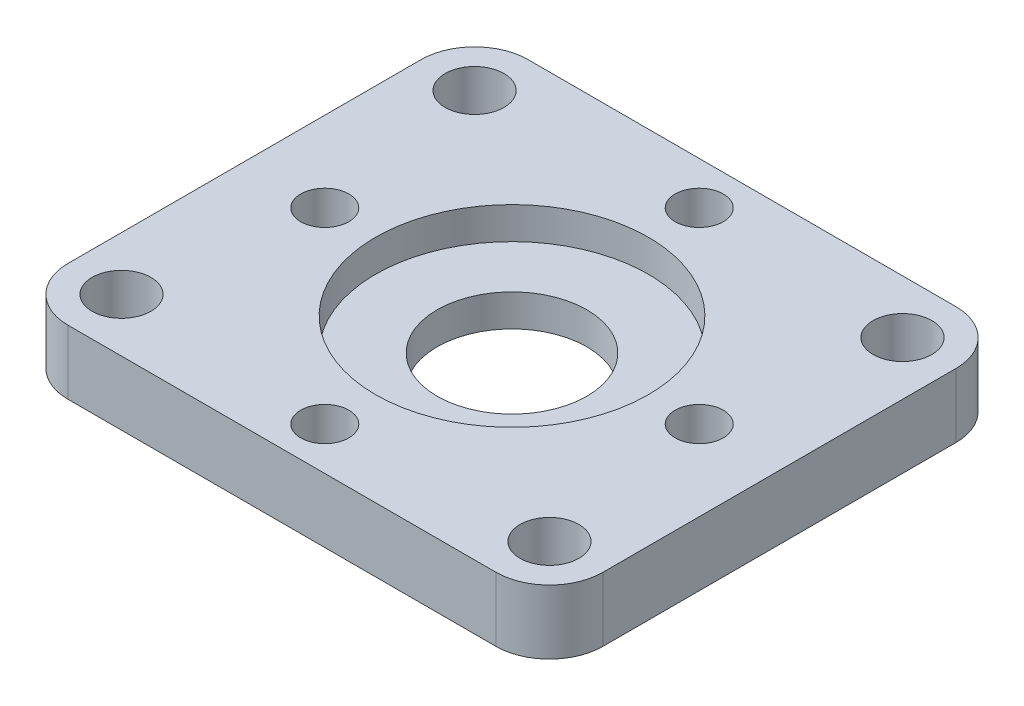
ISO-10303-21;
HEADER;
FILE_DESCRIPTION(('STEP AP214'),'2;1');
FILE_NAME('part.step','',(''),(''),'','','');
FILE_SCHEMA(('AUTOMOTIVE_DESIGN { 1 0 10303 214 1 1 1 1 }'));
ENDSEC;
DATA;
#1=APPLICATION_CONTEXT('core data for automotive mechanical design processes');
#2=APPLICATION_PROTOCOL_DEFINITION('international standard','automotive_design',2000,#1);
#3=PRODUCT_CONTEXT('',#1,'mechanical');
#4=PRODUCT('Part','Part','',(#3));
#5=PRODUCT_RELATED_PRODUCT_CATEGORY('part','',(#4));
#6=PRODUCT_DEFINITION_FORMATION('','',#4);
#7=PRODUCT_DEFINITION_CONTEXT('part definition',#1,'design');
#8=PRODUCT_DEFINITION('design','',#6,#7);
#9=PRODUCT_DEFINITION_SHAPE('','',#8);
#10=(LENGTH_UNIT() NAMED_UNIT(*) SI_UNIT(.MILLI.,.METRE.));
#11=(NAMED_UNIT(*) PLANE_ANGLE_UNIT() SI_UNIT($,.RADIAN.));
#12=(NAMED_UNIT(*) SI_UNIT($,.STERADIAN.) SOLID_ANGLE_UNIT());
#13=UNCERTAINTY_MEASURE_WITH_UNIT(LENGTH_MEASURE(1.E-05),#10,'distance_accuracy_value','');
#14=(GEOMETRIC_REPRESENTATION_CONTEXT(3) GLOBAL_UNCERTAINTY_ASSIGNED_CONTEXT((#13)) GLOBAL_UNIT_ASSIGNED_CONTEXT((#10,
#11,#12)) REPRESENTATION_CONTEXT('',''));
#15=CARTESIAN_POINT('',(0.,0.,0.));
#16=DIRECTION('',(0.,0.,1.));
#17=DIRECTION('',(1.,0.,0.));
#18=AXIS2_PLACEMENT_3D('',#15,#16,#17);
#19=CARTESIAN_POINT('',(0.,0.,0.));
#20=DIRECTION('',(0.,1.,0.));
#21=DIRECTION('',(0.,0.,1.));
#22=AXIS2_PLACEMENT_3D('',#19,#20,#21);
#23=CYLINDRICAL_SURFACE('',#22,7.);
#24=CARTESIAN_POINT('',(0.,0.,0.));
#25=DIRECTION('',(0.,1.,0.));
#26=DIRECTION('',(0.,0.,1.));
#27=AXIS2_PLACEMENT_3D('',#24,#25,#26);
#28=CIRCLE('',#27,7.);
#29=CARTESIAN_POINT('',(0.,0.,7.));
#30=VERTEX_POINT('',#29);
#31=EDGE_CURVE('E201',#30,#30,#28,.T.);
#32=ORIENTED_EDGE('',*,*,#31,.F.);
#33=EDGE_LOOP('',(#32));
#34=FACE_BOUND('',#33,.T.);
#35=CARTESIAN_POINT('',(0.,3.,0.));
#36=DIRECTION('',(0.,1.,0.));
#37=DIRECTION('',(0.,0.,1.));
#38=AXIS2_PLACEMENT_3D('',#35,#36,#37);
#39=CIRCLE('',#38,7.);
#40=CARTESIAN_POINT('',(0.,3.,7.));
#41=VERTEX_POINT('',#40);
#42=EDGE_CURVE('E152',#41,#41,#39,.F.);
#43=ORIENTED_EDGE('',*,*,#42,.F.);
#44=EDGE_LOOP('',(#43));
#45=FACE_BOUND('',#44,.T.);
#46=ADVANCED_FACE('F47',(#34,#45),#23,.F.);
#47=CARTESIAN_POINT('',(-25.,6.,0.));
#48=DIRECTION('',(-1.,0.,0.));
#49=DIRECTION('',(0.,0.,1.));
#50=AXIS2_PLACEMENT_3D('',#47,#48,#49);
#51=PLANE('',#50);
#52=DIRECTION('',(0.,0.,-1.));
#53=VECTOR('',#52,1.);
#54=CARTESIAN_POINT('',(-25.,0.,0.));
#55=LINE('',#54,#53);
#56=CARTESIAN_POINT('',(-25.,0.,16.5));
#57=VERTEX_POINT('',#56);
#58=CARTESIAN_POINT('',(-25.,0.,-16.5));
#59=VERTEX_POINT('',#58);
#60=EDGE_CURVE('E137',#57,#59,#55,.T.);
#61=ORIENTED_EDGE('',*,*,#60,.F.);
#62=DIRECTION('',(0.,-1.,0.));
#63=VECTOR('',#62,1.);
#64=CARTESIAN_POINT('',(-25.,6.,16.5));
#65=LINE('',#64,#63);
#66=CARTESIAN_POINT('',(-25.,6.,16.5));
#67=VERTEX_POINT('',#66);
#68=EDGE_CURVE('E165',#57,#67,#65,.F.);
#69=ORIENTED_EDGE('',*,*,#68,.T.);
#70=DIRECTION('',(0.,0.,-1.));
#71=VECTOR('',#70,1.);
#72=CARTESIAN_POINT('',(-25.,6.,0.));
#73=LINE('',#72,#71);
#74=CARTESIAN_POINT('',(-25.,6.,-16.5));
#75=VERTEX_POINT('',#74);
#76=EDGE_CURVE('E192',#67,#75,#73,.T.);
#77=ORIENTED_EDGE('',*,*,#76,.T.);
#78=DIRECTION('',(0.,-1.,0.));
#79=VECTOR('',#78,1.);
#80=CARTESIAN_POINT('',(-25.,0.,-16.5));
#81=LINE('',#80,#79);
#82=EDGE_CURVE('E161',#75,#59,#81,.T.);
#83=ORIENTED_EDGE('',*,*,#82,.T.);
#84=EDGE_LOOP('',(#61,#69,#77,#83));
#85=FACE_BOUND('',#84,.T.);
#86=ADVANCED_FACE('F246',(#85),#51,.T.);
#87=CARTESIAN_POINT('',(0.,6.,21.5));
#88=DIRECTION('',(0.,0.,1.));
#89=DIRECTION('',(1.,0.,0.));
#90=AXIS2_PLACEMENT_3D('',#87,#88,#89);
#91=PLANE('',#90);
#92=DIRECTION('',(-1.,0.,0.));
#93=VECTOR('',#92,1.);
#94=CARTESIAN_POINT('',(0.,6.,21.5));
#95=LINE('',#94,#93);
#96=CARTESIAN_POINT('',(20.,6.,21.5));
#97=VERTEX_POINT('',#96);
#98=CARTESIAN_POINT('',(-20.,6.,21.5));
#99=VERTEX_POINT('',#98);
#100=EDGE_CURVE('E189',#97,#99,#95,.T.);
#101=ORIENTED_EDGE('',*,*,#100,.T.);
#102=DIRECTION('',(0.,-1.,0.));
#103=VECTOR('',#102,1.);
#104=CARTESIAN_POINT('',(-20.,6.,21.5));
#105=LINE('',#104,#103);
#106=CARTESIAN_POINT('',(-20.,0.,21.5));
#107=VERTEX_POINT('',#106);
#108=EDGE_CURVE('E135',#99,#107,#105,.T.);
#109=ORIENTED_EDGE('',*,*,#108,.T.);
#110=DIRECTION('',(-1.,0.,0.));
#111=VECTOR('',#110,1.);
#112=CARTESIAN_POINT('',(0.,0.,21.5));
#113=LINE('',#112,#111);
#114=CARTESIAN_POINT('',(20.,0.,21.5));
#115=VERTEX_POINT('',#114);
#116=EDGE_CURVE('E117',#115,#107,#113,.T.);
#117=ORIENTED_EDGE('',*,*,#116,.F.);
#118=DIRECTION('',(0.,-1.,0.));
#119=VECTOR('',#118,1.);
#120=CARTESIAN_POINT('',(20.,6.,21.5));
#121=LINE('',#120,#119);
#122=EDGE_CURVE('E132',#115,#97,#121,.F.);
#123=ORIENTED_EDGE('',*,*,#122,.T.);
#124=EDGE_LOOP('',(#101,#109,#117,#123));
#125=FACE_BOUND('',#124,.T.);
#126=ADVANCED_FACE('F131',(#125),#91,.T.);
#127=CARTESIAN_POINT('',(25.,6.,0.));
#128=DIRECTION('',(-1.,0.,0.));
#129=DIRECTION('',(0.,0.,1.));
#130=AXIS2_PLACEMENT_3D('',#127,#128,#129);
#131=PLANE('',#130);
#132=DIRECTION('',(0.,0.,-1.));
#133=VECTOR('',#132,1.);
#134=CARTESIAN_POINT('',(25.,6.,0.));
#135=LINE('',#134,#133);
#136=CARTESIAN_POINT('',(25.,6.,16.5));
#137=VERTEX_POINT('',#136);
#138=CARTESIAN_POINT('',(25.,6.,-16.5));
#139=VERTEX_POINT('',#138);
#140=EDGE_CURVE('E149',#137,#139,#135,.T.);
#141=ORIENTED_EDGE('',*,*,#140,.F.);
#142=DIRECTION('',(0.,-1.,0.));
#143=VECTOR('',#142,1.);
#144=CARTESIAN_POINT('',(25.,0.,16.5));
#145=LINE('',#144,#143);
#146=CARTESIAN_POINT('',(25.,0.,16.5));
#147=VERTEX_POINT('',#146);
#148=EDGE_CURVE('E181',#137,#147,#145,.T.);
#149=ORIENTED_EDGE('',*,*,#148,.T.);
#150=DIRECTION('',(0.,0.,-1.));
#151=VECTOR('',#150,1.);
#152=CARTESIAN_POINT('',(25.,0.,0.));
#153=LINE('',#152,#151);
#154=CARTESIAN_POINT('',(25.,0.,-16.5));
#155=VERTEX_POINT('',#154);
#156=EDGE_CURVE('E119',#147,#155,#153,.T.);
#157=ORIENTED_EDGE('',*,*,#156,.T.);
#158=DIRECTION('',(0.,-1.,0.));
#159=VECTOR('',#158,1.);
#160=CARTESIAN_POINT('',(25.,6.,-16.5));
#161=LINE('',#160,#159);
#162=EDGE_CURVE('E178',#155,#139,#161,.F.);
#163=ORIENTED_EDGE('',*,*,#162,.T.);
#164=EDGE_LOOP('',(#141,#149,#157,#163));
#165=FACE_BOUND('',#164,.T.);
#166=ADVANCED_FACE('F186',(#165),#131,.F.);
#167=CARTESIAN_POINT('',(-20.,6.,16.5));
#168=DIRECTION('',(0.,-1.,0.));
#169=DIRECTION('',(0.,0.,-1.));
#170=AXIS2_PLACEMENT_3D('',#167,#168,#169);
#171=CYLINDRICAL_SURFACE('',#170,2.75);
#172=CARTESIAN_POINT('',(-20.,6.,16.5));
#173=DIRECTION('',(0.,1.,0.));
#174=DIRECTION('',(0.,0.,1.));
#175=AXIS2_PLACEMENT_3D('',#172,#173,#174);
#176=CIRCLE('',#175,2.75);
#177=CARTESIAN_POINT('',(-20.,6.,19.25));
#178=VERTEX_POINT('',#177);
#179=EDGE_CURVE('E237',#178,#178,#176,.T.);
#180=ORIENTED_EDGE('',*,*,#179,.T.);
#181=EDGE_LOOP('',(#180));
#182=FACE_BOUND('',#181,.T.);
#183=CARTESIAN_POINT('',(-20.,0.,16.5));
#184=DIRECTION('',(0.,1.,0.));
#185=DIRECTION('',(0.,0.,1.));
#186=AXIS2_PLACEMENT_3D('',#183,#184,#185);
#187=CIRCLE('',#186,2.75);
#188=CARTESIAN_POINT('',(-20.,0.,19.25));
#189=VERTEX_POINT('',#188);
#190=EDGE_CURVE('E209',#189,#189,#187,.T.);
#191=ORIENTED_EDGE('',*,*,#190,.F.);
#192=EDGE_LOOP('',(#191));
#193=FACE_BOUND('',#192,.T.);
#194=ADVANCED_FACE('F361',(#182,#193),#171,.F.);
#195=CARTESIAN_POINT('',(20.,6.,-16.5));
#196=DIRECTION('',(0.,-1.,0.));
#197=DIRECTION('',(0.,0.,-1.));
#198=AXIS2_PLACEMENT_3D('',#195,#196,#197);
#199=CYLINDRICAL_SURFACE('',#198,2.75);
#200=CARTESIAN_POINT('',(20.,6.,-16.5));
#201=DIRECTION('',(0.,1.,0.));
#202=DIRECTION('',(0.,0.,1.));
#203=AXIS2_PLACEMENT_3D('',#200,#201,#202);
#204=CIRCLE('',#203,2.75);
#205=CARTESIAN_POINT('',(20.,6.,-13.75));
#206=VERTEX_POINT('',#205);
#207=EDGE_CURVE('E229',#206,#206,#204,.T.);
#208=ORIENTED_EDGE('',*,*,#207,.T.);
#209=EDGE_LOOP('',(#208));
#210=FACE_BOUND('',#209,.T.);
#211=CARTESIAN_POINT('',(20.,0.,-16.5));
#212=DIRECTION('',(0.,1.,0.));
#213=DIRECTION('',(0.,0.,1.));
#214=AXIS2_PLACEMENT_3D('',#211,#212,#213);
#215=CIRCLE('',#214,2.75);
#216=CARTESIAN_POINT('',(20.,0.,-13.75));
#217=VERTEX_POINT('',#216);
#218=EDGE_CURVE('E205',#217,#217,#215,.T.);
#219=ORIENTED_EDGE('',*,*,#218,.F.);
#220=EDGE_LOOP('',(#219));
#221=FACE_BOUND('',#220,.T.);
#222=ADVANCED_FACE('F364',(#210,#221),#199,.F.);
#223=CARTESIAN_POINT('',(-20.,6.,-16.5));
#224=DIRECTION('',(0.,-1.,0.));
#225=DIRECTION('',(0.,0.,-1.));
#226=AXIS2_PLACEMENT_3D('',#223,#224,#225);
#227=CYLINDRICAL_SURFACE('',#226,2.75);
#228=CARTESIAN_POINT('',(-20.,6.,-16.5));
#229=DIRECTION('',(0.,1.,0.));
#230=DIRECTION('',(0.,0.,1.));
#231=AXIS2_PLACEMENT_3D('',#228,#229,#230);
#232=CIRCLE('',#231,2.75);
#233=CARTESIAN_POINT('',(-20.,6.,-13.75));
#234=VERTEX_POINT('',#233);
#235=EDGE_CURVE('E223',#234,#234,#232,.T.);
#236=ORIENTED_EDGE('',*,*,#235,.T.);
#237=EDGE_LOOP('',(#236));
#238=FACE_BOUND('',#237,.T.);
#239=CARTESIAN_POINT('',(-20.,0.,-16.5));
#240=DIRECTION('',(0.,1.,0.));
#241=DIRECTION('',(0.,0.,1.));
#242=AXIS2_PLACEMENT_3D('',#239,#240,#241);
#243=CIRCLE('',#242,2.75);
#244=CARTESIAN_POINT('',(-20.,0.,-13.75));
#245=VERTEX_POINT('',#244);
#246=EDGE_CURVE('E200',#245,#245,#243,.T.);
#247=ORIENTED_EDGE('',*,*,#246,.F.);
#248=EDGE_LOOP('',(#247));
#249=FACE_BOUND('',#248,.T.);
#250=ADVANCED_FACE('F371',(#238,#249),#227,.F.);
#251=CARTESIAN_POINT('',(20.,6.,16.5));
#252=DIRECTION('',(0.,-1.,0.));
#253=DIRECTION('',(0.,0.,-1.));
#254=AXIS2_PLACEMENT_3D('',#251,#252,#253);
#255=CYLINDRICAL_SURFACE('',#254,2.75);
#256=CARTESIAN_POINT('',(20.,6.,16.5));
#257=DIRECTION('',(0.,1.,0.));
#258=DIRECTION('',(0.,0.,1.));
#259=AXIS2_PLACEMENT_3D('',#256,#257,#258);
#260=CIRCLE('',#259,2.75);
#261=CARTESIAN_POINT('',(20.,6.,19.25));
#262=VERTEX_POINT('',#261);
#263=EDGE_CURVE('E219',#262,#262,#260,.T.);
#264=ORIENTED_EDGE('',*,*,#263,.T.);
#265=EDGE_LOOP('',(#264));
#266=FACE_BOUND('',#265,.T.);
#267=CARTESIAN_POINT('',(20.,0.,16.5));
#268=DIRECTION('',(0.,1.,0.));
#269=DIRECTION('',(0.,0.,1.));
#270=AXIS2_PLACEMENT_3D('',#267,#268,#269);
#271=CIRCLE('',#270,2.75);
#272=CARTESIAN_POINT('',(20.,0.,19.25));
#273=VERTEX_POINT('',#272);
#274=EDGE_CURVE('E196',#273,#273,#271,.T.);
#275=ORIENTED_EDGE('',*,*,#274,.F.);
#276=EDGE_LOOP('',(#275));
#277=FACE_BOUND('',#276,.T.);
#278=ADVANCED_FACE('F265',(#266,#277),#255,.F.);
#279=CARTESIAN_POINT('',(0.,6.,-21.5));
#280=DIRECTION('',(0.,0.,1.));
#281=DIRECTION('',(1.,0.,0.));
#282=AXIS2_PLACEMENT_3D('',#279,#280,#281);
#283=PLANE('',#282);
#284=DIRECTION('',(-1.,0.,0.));
#285=VECTOR('',#284,1.);
#286=CARTESIAN_POINT('',(0.,6.,-21.5));
#287=LINE('',#286,#285);
#288=CARTESIAN_POINT('',(20.,6.,-21.5));
#289=VERTEX_POINT('',#288);
#290=CARTESIAN_POINT('',(-20.,6.,-21.5));
#291=VERTEX_POINT('',#290);
#292=EDGE_CURVE('E143',#289,#291,#287,.T.);
#293=ORIENTED_EDGE('',*,*,#292,.F.);
#294=DIRECTION('',(0.,-1.,0.));
#295=VECTOR('',#294,1.);
#296=CARTESIAN_POINT('',(20.,6.,-21.5));
#297=LINE('',#296,#295);
#298=CARTESIAN_POINT('',(20.,0.,-21.5));
#299=VERTEX_POINT('',#298);
#300=EDGE_CURVE('E11',#289,#299,#297,.T.);
#301=ORIENTED_EDGE('',*,*,#300,.T.);
#302=DIRECTION('',(-1.,0.,0.));
#303=VECTOR('',#302,1.);
#304=CARTESIAN_POINT('',(0.,0.,-21.5));
#305=LINE('',#304,#303);
#306=CARTESIAN_POINT('',(-20.,0.,-21.5));
#307=VERTEX_POINT('',#306);
#308=EDGE_CURVE('E217',#299,#307,#305,.T.);
#309=ORIENTED_EDGE('',*,*,#308,.T.);
#310=DIRECTION('',(0.,-1.,0.));
#311=VECTOR('',#310,1.);
#312=CARTESIAN_POINT('',(-20.,6.,-21.5));
#313=LINE('',#312,#311);
#314=EDGE_CURVE('E56',#307,#291,#313,.F.);
#315=ORIENTED_EDGE('',*,*,#314,.T.);
#316=EDGE_LOOP('',(#293,#301,#309,#315));
#317=FACE_BOUND('',#316,.T.);
#318=ADVANCED_FACE('F255',(#317),#283,.F.);
#319=CARTESIAN_POINT('',(0.,6.,0.));
#320=DIRECTION('',(0.,1.,0.));
#321=DIRECTION('',(0.,0.,1.));
#322=AXIS2_PLACEMENT_3D('',#319,#320,#321);
#323=PLANE('',#322);
#324=CARTESIAN_POINT('',(0.,6.,0.));
#325=DIRECTION('',(0.,1.,0.));
#326=DIRECTION('',(0.,0.,1.));
#327=AXIS2_PLACEMENT_3D('',#324,#325,#326);
#328=CIRCLE('',#327,12.75);
#329=CARTESIAN_POINT('',(0.,6.,12.75));
#330=VERTEX_POINT('',#329);
#331=EDGE_CURVE('E315',#330,#330,#328,.T.);
#332=ORIENTED_EDGE('',*,*,#331,.F.);
#333=EDGE_LOOP('',(#332));
#334=FACE_BOUND('',#333,.T.);
#335=CARTESIAN_POINT('',(0.,6.,-17.5));
#336=DIRECTION('',(0.,1.,0.));
#337=DIRECTION('',(0.,0.,1.));
#338=AXIS2_PLACEMENT_3D('',#335,#336,#337);
#339=CIRCLE('',#338,2.25);
#340=CARTESIAN_POINT('',(0.,6.,-15.25));
#341=VERTEX_POINT('',#340);
#342=EDGE_CURVE('E325',#341,#341,#339,.T.);
#343=ORIENTED_EDGE('',*,*,#342,.F.);
#344=EDGE_LOOP('',(#343));
#345=FACE_BOUND('',#344,.T.);
#346=CARTESIAN_POINT('',(17.5,6.,0.));
#347=DIRECTION('',(0.,1.,0.));
#348=DIRECTION('',(0.,0.,1.));
#349=AXIS2_PLACEMENT_3D('',#346,#347,#348);
#350=CIRCLE('',#349,2.25);
#351=CARTESIAN_POINT('',(17.5,6.,2.25));
#352=VERTEX_POINT('',#351);
#353=EDGE_CURVE('E333',#352,#352,#350,.T.);
#354=ORIENTED_EDGE('',*,*,#353,.F.);
#355=EDGE_LOOP('',(#354));
#356=FACE_BOUND('',#355,.T.);
#357=CARTESIAN_POINT('',(-17.5,6.,0.));
#358=DIRECTION('',(0.,1.,0.));
#359=DIRECTION('',(0.,0.,1.));
#360=AXIS2_PLACEMENT_3D('',#357,#358,#359);
#361=CIRCLE('',#360,2.25);
#362=CARTESIAN_POINT('',(-17.5,6.,2.25));
#363=VERTEX_POINT('',#362);
#364=EDGE_CURVE('E341',#363,#363,#361,.T.);
#365=ORIENTED_EDGE('',*,*,#364,.F.);
#366=EDGE_LOOP('',(#365));
#367=FACE_BOUND('',#366,.T.);
#368=CARTESIAN_POINT('',(0.,6.,17.5));
#369=DIRECTION('',(0.,1.,0.));
#370=DIRECTION('',(0.,0.,1.));
#371=AXIS2_PLACEMENT_3D('',#368,#369,#370);
#372=CIRCLE('',#371,2.25);
#373=CARTESIAN_POINT('',(0.,6.,19.75));
#374=VERTEX_POINT('',#373);
#375=EDGE_CURVE('E310',#374,#374,#372,.T.);
#376=ORIENTED_EDGE('',*,*,#375,.F.);
#377=EDGE_LOOP('',(#376));
#378=FACE_BOUND('',#377,.T.);
#379=ORIENTED_EDGE('',*,*,#263,.F.);
#380=EDGE_LOOP('',(#379));
#381=FACE_BOUND('',#380,.T.);
#382=ORIENTED_EDGE('',*,*,#235,.F.);
#383=EDGE_LOOP('',(#382));
#384=FACE_BOUND('',#383,.T.);
#385=ORIENTED_EDGE('',*,*,#207,.F.);
#386=EDGE_LOOP('',(#385));
#387=FACE_BOUND('',#386,.T.);
#388=ORIENTED_EDGE('',*,*,#179,.F.);
#389=EDGE_LOOP('',(#388));
#390=FACE_BOUND('',#389,.T.);
#391=ORIENTED_EDGE('',*,*,#76,.F.);
#392=CARTESIAN_POINT('',(-20.,6.,16.5));
#393=DIRECTION('',(0.,1.,0.));
#394=DIRECTION('',(0.,0.,1.));
#395=AXIS2_PLACEMENT_3D('',#392,#393,#394);
#396=CIRCLE('',#395,5.);
#397=EDGE_CURVE('E175',#67,#99,#396,.T.);
#398=ORIENTED_EDGE('',*,*,#397,.T.);
#399=ORIENTED_EDGE('',*,*,#100,.F.);
#400=CARTESIAN_POINT('',(20.,6.,16.5));
#401=DIRECTION('',(0.,1.,0.));
#402=DIRECTION('',(0.,0.,1.));
#403=AXIS2_PLACEMENT_3D('',#400,#401,#402);
#404=CIRCLE('',#403,5.);
#405=EDGE_CURVE('E141',#97,#137,#404,.T.);
#406=ORIENTED_EDGE('',*,*,#405,.T.);
#407=ORIENTED_EDGE('',*,*,#140,.T.);
#408=CARTESIAN_POINT('',(20.,6.,-16.5));
#409=DIRECTION('',(0.,1.,0.));
#410=DIRECTION('',(0.,0.,1.));
#411=AXIS2_PLACEMENT_3D('',#408,#409,#410);
#412=CIRCLE('',#411,5.);
#413=EDGE_CURVE('E69',#139,#289,#412,.T.);
#414=ORIENTED_EDGE('',*,*,#413,.T.);
#415=ORIENTED_EDGE('',*,*,#292,.T.);
#416=CARTESIAN_POINT('',(-20.,6.,-16.5));
#417=DIRECTION('',(0.,1.,0.));
#418=DIRECTION('',(0.,0.,1.));
#419=AXIS2_PLACEMENT_3D('',#416,#417,#418);
#420=CIRCLE('',#419,5.);
#421=EDGE_CURVE('E168',#291,#75,#420,.T.);
#422=ORIENTED_EDGE('',*,*,#421,.T.);
#423=EDGE_LOOP('',(#391,#398,#399,#406,#407,#414,#415,#422));
#424=FACE_BOUND('',#423,.T.);
#425=ADVANCED_FACE('F253',(#334,#345,#356,#367,#378,#381,#384,#387,#390,#424),#323,.T.);
#426=CARTESIAN_POINT('',(0.,0.,0.));
#427=DIRECTION('',(0.,1.,0.));
#428=DIRECTION('',(0.,0.,1.));
#429=AXIS2_PLACEMENT_3D('',#426,#427,#428);
#430=PLANE('',#429);
#431=CARTESIAN_POINT('',(0.,0.,-17.5));
#432=DIRECTION('',(0.,1.,0.));
#433=DIRECTION('',(0.,0.,1.));
#434=AXIS2_PLACEMENT_3D('',#431,#432,#433);
#435=CIRCLE('',#434,2.25);
#436=CARTESIAN_POINT('',(0.,0.,-15.25));
#437=VERTEX_POINT('',#436);
#438=EDGE_CURVE('E321',#437,#437,#435,.T.);
#439=ORIENTED_EDGE('',*,*,#438,.T.);
#440=EDGE_LOOP('',(#439));
#441=FACE_BOUND('',#440,.T.);
#442=CARTESIAN_POINT('',(17.5,0.,0.));
#443=DIRECTION('',(0.,1.,0.));
#444=DIRECTION('',(0.,0.,1.));
#445=AXIS2_PLACEMENT_3D('',#442,#443,#444);
#446=CIRCLE('',#445,2.25);
#447=CARTESIAN_POINT('',(17.5,0.,2.25));
#448=VERTEX_POINT('',#447);
#449=EDGE_CURVE('E329',#448,#448,#446,.T.);
#450=ORIENTED_EDGE('',*,*,#449,.T.);
#451=EDGE_LOOP('',(#450));
#452=FACE_BOUND('',#451,.T.);
#453=CARTESIAN_POINT('',(-17.5,0.,0.));
#454=DIRECTION('',(0.,1.,0.));
#455=DIRECTION('',(0.,0.,1.));
#456=AXIS2_PLACEMENT_3D('',#453,#454,#455);
#457=CIRCLE('',#456,2.25);
#458=CARTESIAN_POINT('',(-17.5,0.,2.25));
#459=VERTEX_POINT('',#458);
#460=EDGE_CURVE('E337',#459,#459,#457,.T.);
#461=ORIENTED_EDGE('',*,*,#460,.T.);
#462=EDGE_LOOP('',(#461));
#463=FACE_BOUND('',#462,.T.);
#464=CARTESIAN_POINT('',(0.,0.,17.5));
#465=DIRECTION('',(0.,1.,0.));
#466=DIRECTION('',(0.,0.,1.));
#467=AXIS2_PLACEMENT_3D('',#464,#465,#466);
#468=CIRCLE('',#467,2.25);
#469=CARTESIAN_POINT('',(0.,0.,19.75));
#470=VERTEX_POINT('',#469);
#471=EDGE_CURVE('E314',#470,#470,#468,.T.);
#472=ORIENTED_EDGE('',*,*,#471,.T.);
#473=EDGE_LOOP('',(#472));
#474=FACE_BOUND('',#473,.T.);
#475=ORIENTED_EDGE('',*,*,#31,.T.);
#476=EDGE_LOOP('',(#475));
#477=FACE_BOUND('',#476,.T.);
#478=ORIENTED_EDGE('',*,*,#274,.T.);
#479=EDGE_LOOP('',(#478));
#480=FACE_BOUND('',#479,.T.);
#481=ORIENTED_EDGE('',*,*,#246,.T.);
#482=EDGE_LOOP('',(#481));
#483=FACE_BOUND('',#482,.T.);
#484=ORIENTED_EDGE('',*,*,#218,.T.);
#485=EDGE_LOOP('',(#484));
#486=FACE_BOUND('',#485,.T.);
#487=ORIENTED_EDGE('',*,*,#190,.T.);
#488=EDGE_LOOP('',(#487));
#489=FACE_BOUND('',#488,.T.);
#490=ORIENTED_EDGE('',*,*,#116,.T.);
#491=CARTESIAN_POINT('',(-20.,0.,16.5));
#492=DIRECTION('',(0.,1.,0.));
#493=DIRECTION('',(0.,0.,1.));
#494=AXIS2_PLACEMENT_3D('',#491,#492,#493);
#495=CIRCLE('',#494,5.);
#496=EDGE_CURVE('E125',#107,#57,#495,.F.);
#497=ORIENTED_EDGE('',*,*,#496,.T.);
#498=ORIENTED_EDGE('',*,*,#60,.T.);
#499=CARTESIAN_POINT('',(-20.,0.,-16.5));
#500=DIRECTION('',(0.,1.,0.));
#501=DIRECTION('',(0.,0.,1.));
#502=AXIS2_PLACEMENT_3D('',#499,#500,#501);
#503=CIRCLE('',#502,5.);
#504=EDGE_CURVE('E147',#59,#307,#503,.F.);
#505=ORIENTED_EDGE('',*,*,#504,.T.);
#506=ORIENTED_EDGE('',*,*,#308,.F.);
#507=CARTESIAN_POINT('',(20.,0.,-16.5));
#508=DIRECTION('',(0.,1.,0.));
#509=DIRECTION('',(0.,0.,1.));
#510=AXIS2_PLACEMENT_3D('',#507,#508,#509);
#511=CIRCLE('',#510,5.);
#512=EDGE_CURVE('E126',#299,#155,#511,.F.);
#513=ORIENTED_EDGE('',*,*,#512,.T.);
#514=ORIENTED_EDGE('',*,*,#156,.F.);
#515=CARTESIAN_POINT('',(20.,0.,16.5));
#516=DIRECTION('',(0.,1.,0.));
#517=DIRECTION('',(0.,0.,1.));
#518=AXIS2_PLACEMENT_3D('',#515,#516,#517);
#519=CIRCLE('',#518,5.);
#520=EDGE_CURVE('E114',#147,#115,#519,.F.);
#521=ORIENTED_EDGE('',*,*,#520,.T.);
#522=EDGE_LOOP('',(#490,#497,#498,#505,#506,#513,#514,#521));
#523=FACE_BOUND('',#522,.T.);
#524=ADVANCED_FACE('F116',(#441,#452,#463,#474,#477,#480,#483,#486,#489,#523),#430,.F.);
#525=CARTESIAN_POINT('',(0.,0.,17.5));
#526=DIRECTION('',(0.,1.,0.));
#527=DIRECTION('',(0.,0.,1.));
#528=AXIS2_PLACEMENT_3D('',#525,#526,#527);
#529=CYLINDRICAL_SURFACE('',#528,2.25);
#530=ORIENTED_EDGE('',*,*,#471,.F.);
#531=EDGE_LOOP('',(#530));
#532=FACE_BOUND('',#531,.T.);
#533=ORIENTED_EDGE('',*,*,#375,.T.);
#534=EDGE_LOOP('',(#533));
#535=FACE_BOUND('',#534,.T.);
#536=ADVANCED_FACE('F262',(#532,#535),#529,.F.);
#537=CARTESIAN_POINT('',(-17.5,0.,0.));
#538=DIRECTION('',(0.,1.,0.));
#539=DIRECTION('',(0.,0.,1.));
#540=AXIS2_PLACEMENT_3D('',#537,#538,#539);
#541=CYLINDRICAL_SURFACE('',#540,2.25);
#542=ORIENTED_EDGE('',*,*,#460,.F.);
#543=EDGE_LOOP('',(#542));
#544=FACE_BOUND('',#543,.T.);
#545=ORIENTED_EDGE('',*,*,#364,.T.);
#546=EDGE_LOOP('',(#545));
#547=FACE_BOUND('',#546,.T.);
#548=ADVANCED_FACE('F283',(#544,#547),#541,.F.);
#549=CARTESIAN_POINT('',(17.5,0.,0.));
#550=DIRECTION('',(0.,1.,0.));
#551=DIRECTION('',(0.,0.,1.));
#552=AXIS2_PLACEMENT_3D('',#549,#550,#551);
#553=CYLINDRICAL_SURFACE('',#552,2.25);
#554=ORIENTED_EDGE('',*,*,#449,.F.);
#555=EDGE_LOOP('',(#554));
#556=FACE_BOUND('',#555,.T.);
#557=ORIENTED_EDGE('',*,*,#353,.T.);
#558=EDGE_LOOP('',(#557));
#559=FACE_BOUND('',#558,.T.);
#560=ADVANCED_FACE('F287',(#556,#559),#553,.F.);
#561=CARTESIAN_POINT('',(0.,0.,-17.5));
#562=DIRECTION('',(0.,1.,0.));
#563=DIRECTION('',(0.,0.,1.));
#564=AXIS2_PLACEMENT_3D('',#561,#562,#563);
#565=CYLINDRICAL_SURFACE('',#564,2.25);
#566=ORIENTED_EDGE('',*,*,#438,.F.);
#567=EDGE_LOOP('',(#566));
#568=FACE_BOUND('',#567,.T.);
#569=ORIENTED_EDGE('',*,*,#342,.T.);
#570=EDGE_LOOP('',(#569));
#571=FACE_BOUND('',#570,.T.);
#572=ADVANCED_FACE('F291',(#568,#571),#565,.F.);
#573=CARTESIAN_POINT('',(0.,3.,0.));
#574=DIRECTION('',(0.,1.,0.));
#575=DIRECTION('',(0.,0.,1.));
#576=AXIS2_PLACEMENT_3D('',#573,#574,#575);
#577=PLANE('',#576);
#578=CARTESIAN_POINT('',(0.,3.,0.));
#579=DIRECTION('',(0.,1.,0.));
#580=DIRECTION('',(0.,0.,1.));
#581=AXIS2_PLACEMENT_3D('',#578,#579,#580);
#582=CIRCLE('',#581,12.75);
#583=CARTESIAN_POINT('',(0.,3.,12.75));
#584=VERTEX_POINT('',#583);
#585=EDGE_CURVE('E306',#584,#584,#582,.T.);
#586=ORIENTED_EDGE('',*,*,#585,.T.);
#587=EDGE_LOOP('',(#586));
#588=FACE_BOUND('',#587,.T.);
#589=ORIENTED_EDGE('',*,*,#42,.T.);
#590=EDGE_LOOP('',(#589));
#591=FACE_BOUND('',#590,.T.);
#592=ADVANCED_FACE('F294',(#588,#591),#577,.T.);
#593=CARTESIAN_POINT('',(0.,3.,0.));
#594=DIRECTION('',(0.,1.,0.));
#595=DIRECTION('',(0.,0.,1.));
#596=AXIS2_PLACEMENT_3D('',#593,#594,#595);
#597=CYLINDRICAL_SURFACE('',#596,12.75);
#598=ORIENTED_EDGE('',*,*,#585,.F.);
#599=EDGE_LOOP('',(#598));
#600=FACE_BOUND('',#599,.T.);
#601=ORIENTED_EDGE('',*,*,#331,.T.);
#602=EDGE_LOOP('',(#601));
#603=FACE_BOUND('',#602,.T.);
#604=ADVANCED_FACE('F296',(#600,#603),#597,.F.);
#605=CARTESIAN_POINT('',(-20.,6.,16.5));
#606=DIRECTION('',(0.,-1.,0.));
#607=DIRECTION('',(0.,0.,-1.));
#608=AXIS2_PLACEMENT_3D('',#605,#606,#607);
#609=CYLINDRICAL_SURFACE('',#608,5.);
#610=ORIENTED_EDGE('',*,*,#397,.F.);
#611=ORIENTED_EDGE('',*,*,#68,.F.);
#612=ORIENTED_EDGE('',*,*,#496,.F.);
#613=ORIENTED_EDGE('',*,*,#108,.F.);
#614=EDGE_LOOP('',(#610,#611,#612,#613));
#615=FACE_BOUND('',#614,.T.);
#616=ADVANCED_FACE('F252',(#615),#609,.T.);
#617=CARTESIAN_POINT('',(20.,6.,16.5));
#618=DIRECTION('',(0.,1.,0.));
#619=DIRECTION('',(0.,0.,1.));
#620=AXIS2_PLACEMENT_3D('',#617,#618,#619);
#621=CYLINDRICAL_SURFACE('',#620,5.);
#622=ORIENTED_EDGE('',*,*,#405,.F.);
#623=ORIENTED_EDGE('',*,*,#122,.F.);
#624=ORIENTED_EDGE('',*,*,#520,.F.);
#625=ORIENTED_EDGE('',*,*,#148,.F.);
#626=EDGE_LOOP('',(#622,#623,#624,#625));
#627=FACE_BOUND('',#626,.T.);
#628=ADVANCED_FACE('F140',(#627),#621,.T.);
#629=CARTESIAN_POINT('',(20.,6.,-16.5));
#630=DIRECTION('',(0.,-1.,0.));
#631=DIRECTION('',(0.,0.,-1.));
#632=AXIS2_PLACEMENT_3D('',#629,#630,#631);
#633=CYLINDRICAL_SURFACE('',#632,5.);
#634=ORIENTED_EDGE('',*,*,#413,.F.);
#635=ORIENTED_EDGE('',*,*,#162,.F.);
#636=ORIENTED_EDGE('',*,*,#512,.F.);
#637=ORIENTED_EDGE('',*,*,#300,.F.);
#638=EDGE_LOOP('',(#634,#635,#636,#637));
#639=FACE_BOUND('',#638,.T.);
#640=ADVANCED_FACE('F386',(#639),#633,.T.);
#641=CARTESIAN_POINT('',(-20.,6.,-16.5));
#642=DIRECTION('',(0.,1.,0.));
#643=DIRECTION('',(0.,0.,1.));
#644=AXIS2_PLACEMENT_3D('',#641,#642,#643);
#645=CYLINDRICAL_SURFACE('',#644,5.);
#646=ORIENTED_EDGE('',*,*,#421,.F.);
#647=ORIENTED_EDGE('',*,*,#314,.F.);
#648=ORIENTED_EDGE('',*,*,#504,.F.);
#649=ORIENTED_EDGE('',*,*,#82,.F.);
#650=EDGE_LOOP('',(#646,#647,#648,#649));
#651=FACE_BOUND('',#650,.T.);
#652=ADVANCED_FACE('F49',(#651),#645,.T.);
#653=CLOSED_SHELL('',(#46,#86,#126,#166,#194,#222,#250,#278,#318,#425,#524,#536,#548,#560,#572,
#592,#604,#616,#628,#640,#652));
#654=MANIFOLD_SOLID_BREP('B2',#653);
#655=ADVANCED_BREP_SHAPE_REPRESENTATION('',(#18,#654),#14);
#656=SHAPE_DEFINITION_REPRESENTATION(#9,#655);
ENDSEC;
END-ISO-10303-21;
